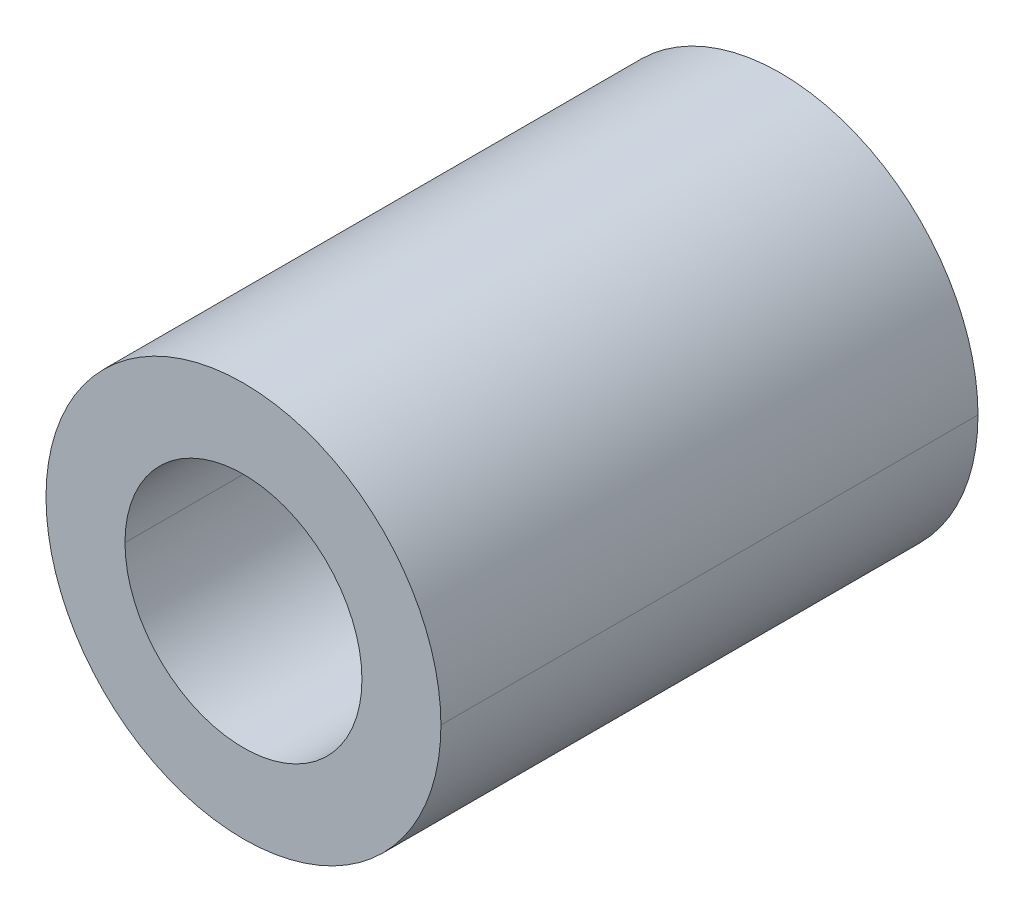
ISO-10303-21;
HEADER;
FILE_DESCRIPTION(('STEP AP214'),'2;1');
FILE_NAME('part.step','',(''),(''),'','','');
FILE_SCHEMA(('AUTOMOTIVE_DESIGN { 1 0 10303 214 1 1 1 1 }'));
ENDSEC;
DATA;
#1=APPLICATION_CONTEXT('core data for automotive mechanical design processes');
#2=APPLICATION_PROTOCOL_DEFINITION('international standard','automotive_design',2000,#1);
#3=PRODUCT_CONTEXT('',#1,'mechanical');
#4=PRODUCT('Part','Part','',(#3));
#5=PRODUCT_RELATED_PRODUCT_CATEGORY('part','',(#4));
#6=PRODUCT_DEFINITION_FORMATION('','',#4);
#7=PRODUCT_DEFINITION_CONTEXT('part definition',#1,'design');
#8=PRODUCT_DEFINITION('design','',#6,#7);
#9=PRODUCT_DEFINITION_SHAPE('','',#8);
#10=(LENGTH_UNIT() NAMED_UNIT(*) SI_UNIT(.MILLI.,.METRE.));
#11=(NAMED_UNIT(*) PLANE_ANGLE_UNIT() SI_UNIT($,.RADIAN.));
#12=(NAMED_UNIT(*) SI_UNIT($,.STERADIAN.) SOLID_ANGLE_UNIT());
#13=UNCERTAINTY_MEASURE_WITH_UNIT(LENGTH_MEASURE(1.E-05),#10,'distance_accuracy_value','');
#14=(GEOMETRIC_REPRESENTATION_CONTEXT(3) GLOBAL_UNCERTAINTY_ASSIGNED_CONTEXT((#13)) GLOBAL_UNIT_ASSIGNED_CONTEXT((#10,
#11,#12)) REPRESENTATION_CONTEXT('',''));
#15=CARTESIAN_POINT('',(0.,0.,0.));
#16=DIRECTION('',(0.,0.,1.));
#17=DIRECTION('',(1.,0.,0.));
#18=AXIS2_PLACEMENT_3D('',#15,#16,#17);
#19=CARTESIAN_POINT('',(0.,0.,6.8));
#20=DIRECTION('',(0.,0.,-1.));
#21=DIRECTION('',(-1.,0.,0.));
#22=AXIS2_PLACEMENT_3D('',#19,#20,#21);
#23=CYLINDRICAL_SURFACE('',#22,1.5);
#24=DIRECTION('',(0.,0.,-1.));
#25=VECTOR('',#24,1.);
#26=CARTESIAN_POINT('',(1.5,0.,6.8));
#27=LINE('',#26,#25);
#28=CARTESIAN_POINT('',(1.5,0.,6.8));
#29=VERTEX_POINT('',#28);
#30=CARTESIAN_POINT('',(1.5,0.,0.));
#31=VERTEX_POINT('',#30);
#32=EDGE_CURVE('E95',#29,#31,#27,.T.);
#33=ORIENTED_EDGE('',*,*,#32,.F.);
#34=CARTESIAN_POINT('',(0.,0.,6.8));
#35=DIRECTION('',(0.,0.,1.));
#36=DIRECTION('',(1.,0.,0.));
#37=AXIS2_PLACEMENT_3D('',#34,#35,#36);
#38=CIRCLE('',#37,1.5);
#39=CARTESIAN_POINT('',(-1.5,0.,6.8));
#40=VERTEX_POINT('',#39);
#41=EDGE_CURVE('E21',#29,#40,#38,.T.);
#42=ORIENTED_EDGE('',*,*,#41,.T.);
#43=DIRECTION('',(0.,0.,-1.));
#44=VECTOR('',#43,1.);
#45=CARTESIAN_POINT('',(-1.5,0.,6.8));
#46=LINE('',#45,#44);
#47=CARTESIAN_POINT('',(-1.5,0.,0.));
#48=VERTEX_POINT('',#47);
#49=EDGE_CURVE('E80',#40,#48,#46,.T.);
#50=ORIENTED_EDGE('',*,*,#49,.T.);
#51=CARTESIAN_POINT('',(0.,0.,0.));
#52=DIRECTION('',(0.,0.,1.));
#53=DIRECTION('',(1.,0.,0.));
#54=AXIS2_PLACEMENT_3D('',#51,#52,#53);
#55=CIRCLE('',#54,1.5);
#56=EDGE_CURVE('E11',#31,#48,#55,.T.);
#57=ORIENTED_EDGE('',*,*,#56,.F.);
#58=EDGE_LOOP('',(#33,#42,#50,#57));
#59=FACE_BOUND('',#58,.T.);
#60=ADVANCED_FACE('F17',(#59),#23,.F.);
#61=CARTESIAN_POINT('',(0.,0.,6.8));
#62=DIRECTION('',(0.,0.,-1.));
#63=DIRECTION('',(-1.,0.,0.));
#64=AXIS2_PLACEMENT_3D('',#61,#62,#63);
#65=CYLINDRICAL_SURFACE('',#64,2.5);
#66=DIRECTION('',(0.,0.,-1.));
#67=VECTOR('',#66,1.);
#68=CARTESIAN_POINT('',(2.5,0.,6.8));
#69=LINE('',#68,#67);
#70=CARTESIAN_POINT('',(2.5,0.,6.8));
#71=VERTEX_POINT('',#70);
#72=CARTESIAN_POINT('',(2.5,0.,0.));
#73=VERTEX_POINT('',#72);
#74=EDGE_CURVE('E69',#71,#73,#69,.T.);
#75=ORIENTED_EDGE('',*,*,#74,.F.);
#76=CARTESIAN_POINT('',(0.,0.,6.8));
#77=DIRECTION('',(0.,0.,1.));
#78=DIRECTION('',(1.,0.,0.));
#79=AXIS2_PLACEMENT_3D('',#76,#77,#78);
#80=CIRCLE('',#79,2.5);
#81=CARTESIAN_POINT('',(-2.5,0.,6.8));
#82=VERTEX_POINT('',#81);
#83=EDGE_CURVE('E59',#82,#71,#80,.T.);
#84=ORIENTED_EDGE('',*,*,#83,.F.);
#85=DIRECTION('',(0.,0.,-1.));
#86=VECTOR('',#85,1.);
#87=CARTESIAN_POINT('',(-2.5,0.,6.8));
#88=LINE('',#87,#86);
#89=CARTESIAN_POINT('',(-2.5,0.,0.));
#90=VERTEX_POINT('',#89);
#91=EDGE_CURVE('E66',#82,#90,#88,.T.);
#92=ORIENTED_EDGE('',*,*,#91,.T.);
#93=CARTESIAN_POINT('',(0.,0.,0.));
#94=DIRECTION('',(0.,0.,1.));
#95=DIRECTION('',(1.,0.,0.));
#96=AXIS2_PLACEMENT_3D('',#93,#94,#95);
#97=CIRCLE('',#96,2.5);
#98=EDGE_CURVE('E28',#90,#73,#97,.T.);
#99=ORIENTED_EDGE('',*,*,#98,.T.);
#100=EDGE_LOOP('',(#75,#84,#92,#99));
#101=FACE_BOUND('',#100,.T.);
#102=ADVANCED_FACE('F19',(#101),#65,.T.);
#103=CARTESIAN_POINT('',(0.,0.,0.));
#104=DIRECTION('',(0.,0.,1.));
#105=DIRECTION('',(1.,0.,0.));
#106=AXIS2_PLACEMENT_3D('',#103,#104,#105);
#107=PLANE('',#106);
#108=CARTESIAN_POINT('',(0.,0.,0.));
#109=DIRECTION('',(0.,0.,1.));
#110=DIRECTION('',(1.,0.,0.));
#111=AXIS2_PLACEMENT_3D('',#108,#109,#110);
#112=CIRCLE('',#111,1.5);
#113=EDGE_CURVE('E88',#48,#31,#112,.T.);
#114=ORIENTED_EDGE('',*,*,#113,.T.);
#115=ORIENTED_EDGE('',*,*,#56,.T.);
#116=EDGE_LOOP('',(#114,#115));
#117=FACE_BOUND('',#116,.T.);
#118=ORIENTED_EDGE('',*,*,#98,.F.);
#119=CARTESIAN_POINT('',(0.,0.,0.));
#120=DIRECTION('',(0.,0.,1.));
#121=DIRECTION('',(1.,0.,0.));
#122=AXIS2_PLACEMENT_3D('',#119,#120,#121);
#123=CIRCLE('',#122,2.5);
#124=EDGE_CURVE('E75',#73,#90,#123,.T.);
#125=ORIENTED_EDGE('',*,*,#124,.F.);
#126=EDGE_LOOP('',(#118,#125));
#127=FACE_BOUND('',#126,.T.);
#128=ADVANCED_FACE('F126',(#117,#127),#107,.F.);
#129=CARTESIAN_POINT('',(0.,0.,6.8));
#130=DIRECTION('',(0.,0.,1.));
#131=DIRECTION('',(1.,0.,0.));
#132=AXIS2_PLACEMENT_3D('',#129,#130,#131);
#133=PLANE('',#132);
#134=CARTESIAN_POINT('',(0.,0.,6.8));
#135=DIRECTION('',(0.,0.,1.));
#136=DIRECTION('',(1.,0.,0.));
#137=AXIS2_PLACEMENT_3D('',#134,#135,#136);
#138=CIRCLE('',#137,1.5);
#139=EDGE_CURVE('E91',#40,#29,#138,.T.);
#140=ORIENTED_EDGE('',*,*,#139,.F.);
#141=ORIENTED_EDGE('',*,*,#41,.F.);
#142=EDGE_LOOP('',(#140,#141));
#143=FACE_BOUND('',#142,.T.);
#144=ORIENTED_EDGE('',*,*,#83,.T.);
#145=CARTESIAN_POINT('',(0.,0.,6.8));
#146=DIRECTION('',(0.,0.,1.));
#147=DIRECTION('',(1.,0.,0.));
#148=AXIS2_PLACEMENT_3D('',#145,#146,#147);
#149=CIRCLE('',#148,2.5);
#150=EDGE_CURVE('E74',#71,#82,#149,.T.);
#151=ORIENTED_EDGE('',*,*,#150,.T.);
#152=EDGE_LOOP('',(#144,#151));
#153=FACE_BOUND('',#152,.T.);
#154=ADVANCED_FACE('F78',(#143,#153),#133,.T.);
#155=CARTESIAN_POINT('',(0.,0.,6.8));
#156=DIRECTION('',(0.,0.,-1.));
#157=DIRECTION('',(-1.,0.,0.));
#158=AXIS2_PLACEMENT_3D('',#155,#156,#157);
#159=CYLINDRICAL_SURFACE('',#158,2.5);
#160=ORIENTED_EDGE('',*,*,#150,.F.);
#161=ORIENTED_EDGE('',*,*,#74,.T.);
#162=ORIENTED_EDGE('',*,*,#124,.T.);
#163=ORIENTED_EDGE('',*,*,#91,.F.);
#164=EDGE_LOOP('',(#160,#161,#162,#163));
#165=FACE_BOUND('',#164,.T.);
#166=ADVANCED_FACE('F73',(#165),#159,.T.);
#167=CARTESIAN_POINT('',(0.,0.,6.8));
#168=DIRECTION('',(0.,0.,-1.));
#169=DIRECTION('',(-1.,0.,0.));
#170=AXIS2_PLACEMENT_3D('',#167,#168,#169);
#171=CYLINDRICAL_SURFACE('',#170,1.5);
#172=ORIENTED_EDGE('',*,*,#139,.T.);
#173=ORIENTED_EDGE('',*,*,#32,.T.);
#174=ORIENTED_EDGE('',*,*,#113,.F.);
#175=ORIENTED_EDGE('',*,*,#49,.F.);
#176=EDGE_LOOP('',(#172,#173,#174,#175));
#177=FACE_BOUND('',#176,.T.);
#178=ADVANCED_FACE('F124',(#177),#171,.F.);
#179=CLOSED_SHELL('',(#60,#102,#128,#154,#166,#178));
#180=MANIFOLD_SOLID_BREP('B1',#179);
#181=ADVANCED_BREP_SHAPE_REPRESENTATION('',(#18,#180),#14);
#182=SHAPE_DEFINITION_REPRESENTATION(#9,#181);
ENDSEC;
END-ISO-10303-21;
